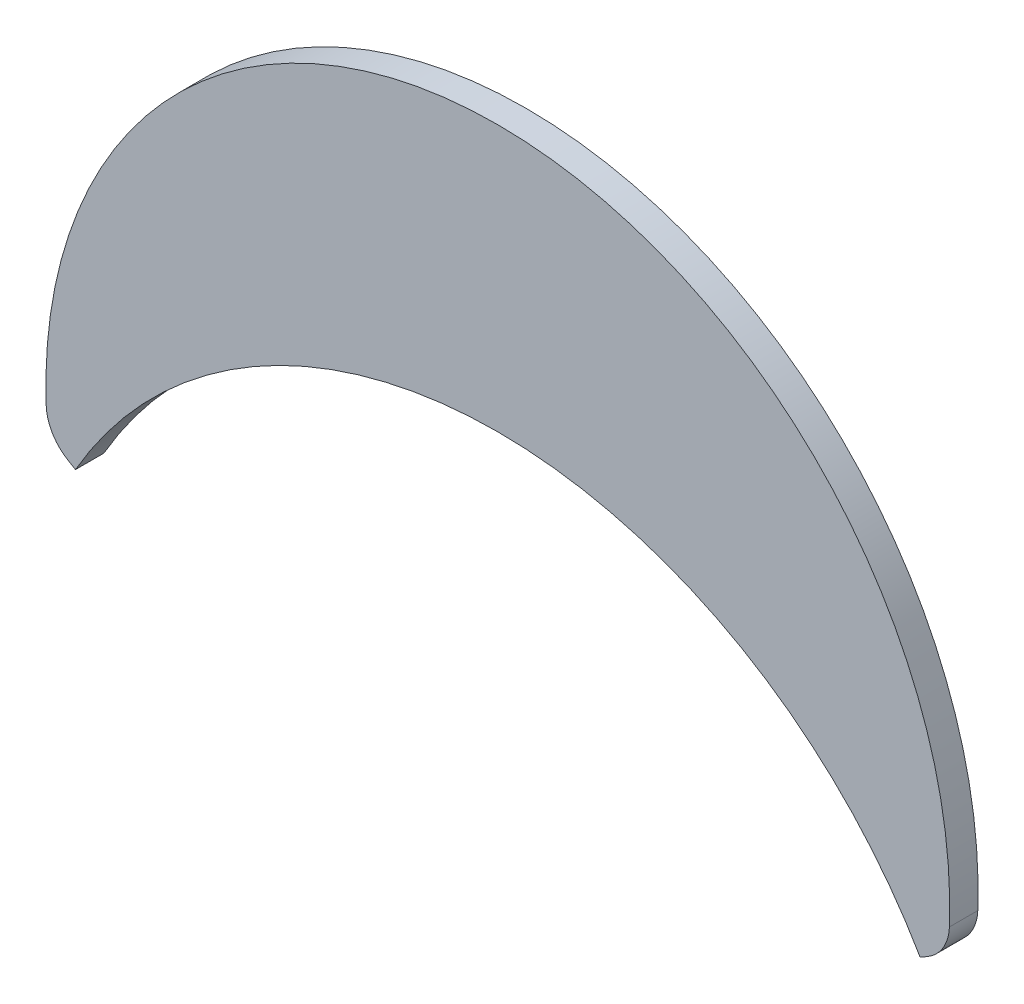
ISO-10303-21;
HEADER;
FILE_DESCRIPTION(('STEP AP214'),'2;1');
FILE_NAME('part.step','',(''),(''),'','','');
FILE_SCHEMA(('AUTOMOTIVE_DESIGN { 1 0 10303 214 1 1 1 1 }'));
ENDSEC;
DATA;
#1=APPLICATION_CONTEXT('core data for automotive mechanical design processes');
#2=APPLICATION_PROTOCOL_DEFINITION('international standard','automotive_design',2000,#1);
#3=PRODUCT_CONTEXT('',#1,'mechanical');
#4=PRODUCT('Part','Part','',(#3));
#5=PRODUCT_RELATED_PRODUCT_CATEGORY('part','',(#4));
#6=PRODUCT_DEFINITION_FORMATION('','',#4);
#7=PRODUCT_DEFINITION_CONTEXT('part definition',#1,'design');
#8=PRODUCT_DEFINITION('design','',#6,#7);
#9=PRODUCT_DEFINITION_SHAPE('','',#8);
#10=(LENGTH_UNIT() NAMED_UNIT(*) SI_UNIT(.MILLI.,.METRE.));
#11=(NAMED_UNIT(*) PLANE_ANGLE_UNIT() SI_UNIT($,.RADIAN.));
#12=(NAMED_UNIT(*) SI_UNIT($,.STERADIAN.) SOLID_ANGLE_UNIT());
#13=UNCERTAINTY_MEASURE_WITH_UNIT(LENGTH_MEASURE(1.E-05),#10,'distance_accuracy_value','');
#14=(GEOMETRIC_REPRESENTATION_CONTEXT(3) GLOBAL_UNCERTAINTY_ASSIGNED_CONTEXT((#13)) GLOBAL_UNIT_ASSIGNED_CONTEXT((#10,
#11,#12)) REPRESENTATION_CONTEXT('',''));
#15=CARTESIAN_POINT('',(0.,0.,0.));
#16=DIRECTION('',(0.,0.,1.));
#17=DIRECTION('',(1.,0.,0.));
#18=AXIS2_PLACEMENT_3D('',#15,#16,#17);
#19=CARTESIAN_POINT('',(15.1229686135858,8.73124999999997,1.016));
#20=DIRECTION('',(-0.499999999999998,0.86602540378444,0.));
#21=DIRECTION('',(-0.86602540378444,-0.499999999999998,0.));
#22=AXIS2_PLACEMENT_3D('',#19,#20,#21);
#23=PLANE('',#22);
#24=DIRECTION('',(0.86602540378444,0.499999999999998,0.));
#25=VECTOR('',#24,1.);
#26=CARTESIAN_POINT('',(15.1229686135858,8.73124999999997,0.));
#27=LINE('',#26,#25);
#28=CARTESIAN_POINT('',(15.1229686135858,8.73124999999997,0.));
#29=VERTEX_POINT('',#28);
#30=CARTESIAN_POINT('',(15.3785341565457,8.87880083502345,0.));
#31=VERTEX_POINT('',#30);
#32=EDGE_CURVE('E139',#29,#31,#27,.T.);
#33=ORIENTED_EDGE('',*,*,#32,.T.);
#34=DIRECTION('',(0.,0.,-1.));
#35=VECTOR('',#34,1.);
#36=CARTESIAN_POINT('',(15.3785341565457,8.87880083502345,1.016));
#37=LINE('',#36,#35);
#38=CARTESIAN_POINT('',(15.3785341565457,8.87880083502345,1.016));
#39=VERTEX_POINT('',#38);
#40=EDGE_CURVE('E103',#31,#39,#37,.F.);
#41=ORIENTED_EDGE('',*,*,#40,.T.);
#42=DIRECTION('',(0.86602540378444,0.499999999999998,0.));
#43=VECTOR('',#42,1.);
#44=CARTESIAN_POINT('',(15.1229686135858,8.73124999999997,1.016));
#45=LINE('',#44,#43);
#46=CARTESIAN_POINT('',(15.1229686135858,8.73124999999997,1.016));
#47=VERTEX_POINT('',#46);
#48=EDGE_CURVE('E96',#47,#39,#45,.T.);
#49=ORIENTED_EDGE('',*,*,#48,.F.);
#50=DIRECTION('',(0.,0.,-1.));
#51=VECTOR('',#50,1.);
#52=CARTESIAN_POINT('',(15.1229686135858,8.73124999999997,1.016));
#53=LINE('',#52,#51);
#54=EDGE_CURVE('E100',#47,#29,#53,.T.);
#55=ORIENTED_EDGE('',*,*,#54,.T.);
#56=EDGE_LOOP('',(#33,#41,#49,#55));
#57=FACE_BOUND('',#56,.T.);
#58=ADVANCED_FACE('F42',(#57),#23,.F.);
#59=CARTESIAN_POINT('',(-23.3718605846326,13.4937499999999,1.016));
#60=DIRECTION('',(0.499999999999998,0.86602540378444,0.));
#61=DIRECTION('',(-0.86602540378444,0.499999999999998,0.));
#62=AXIS2_PLACEMENT_3D('',#59,#60,#61);
#63=PLANE('',#62);
#64=DIRECTION('',(0.86602540378444,-0.499999999999998,0.));
#65=VECTOR('',#64,1.);
#66=CARTESIAN_POINT('',(-23.3718605846326,13.4937499999999,1.016));
#67=LINE('',#66,#65);
#68=CARTESIAN_POINT('',(-15.3785341565457,8.87880083502345,1.016));
#69=VERTEX_POINT('',#68);
#70=CARTESIAN_POINT('',(-15.1229686135858,8.73124999999996,1.016));
#71=VERTEX_POINT('',#70);
#72=EDGE_CURVE('E105',#69,#71,#67,.T.);
#73=ORIENTED_EDGE('',*,*,#72,.F.);
#74=DIRECTION('',(0.,0.,-1.));
#75=VECTOR('',#74,1.);
#76=CARTESIAN_POINT('',(-15.3785341565457,8.87880083502345,0.));
#77=LINE('',#76,#75);
#78=CARTESIAN_POINT('',(-15.3785341565457,8.87880083502345,0.));
#79=VERTEX_POINT('',#78);
#80=EDGE_CURVE('E12',#69,#79,#77,.T.);
#81=ORIENTED_EDGE('',*,*,#80,.T.);
#82=DIRECTION('',(0.86602540378444,-0.499999999999998,0.));
#83=VECTOR('',#82,1.);
#84=CARTESIAN_POINT('',(-23.3718605846326,13.4937499999999,0.));
#85=LINE('',#84,#83);
#86=CARTESIAN_POINT('',(-15.1229686135858,8.73124999999996,0.));
#87=VERTEX_POINT('',#86);
#88=EDGE_CURVE('E114',#79,#87,#85,.T.);
#89=ORIENTED_EDGE('',*,*,#88,.T.);
#90=DIRECTION('',(0.,0.,-1.));
#91=VECTOR('',#90,1.);
#92=CARTESIAN_POINT('',(-15.1229686135858,8.73124999999996,1.016));
#93=LINE('',#92,#91);
#94=EDGE_CURVE('E120',#71,#87,#93,.T.);
#95=ORIENTED_EDGE('',*,*,#94,.F.);
#96=EDGE_LOOP('',(#73,#81,#89,#95));
#97=FACE_BOUND('',#96,.T.);
#98=ADVANCED_FACE('F154',(#97),#63,.F.);
#99=CARTESIAN_POINT('',(0.,0.,1.016));
#100=DIRECTION('',(0.,0.,1.));
#101=DIRECTION('',(1.,0.,0.));
#102=AXIS2_PLACEMENT_3D('',#99,#100,#101);
#103=PLANE('',#102);
#104=ORIENTED_EDGE('',*,*,#48,.T.);
#105=CARTESIAN_POINT('',(14.5847841565457,10.2536161635313,1.016));
#106=DIRECTION('',(0.,0.,1.));
#107=DIRECTION('',(1.,0.,0.));
#108=AXIS2_PLACEMENT_3D('',#105,#106,#107);
#109=CIRCLE('',#108,1.5875);
#110=CARTESIAN_POINT('',(16.1711517077853,10.1936641629468,1.016));
#111=VERTEX_POINT('',#110);
#112=EDGE_CURVE('E130',#39,#111,#109,.T.);
#113=ORIENTED_EDGE('',*,*,#112,.T.);
#114=CARTESIAN_POINT('',(0.,10.8048043087971,1.016));
#115=DIRECTION('',(0.,0.,1.));
#116=DIRECTION('',(-1.,0.,0.));
#117=AXIS2_PLACEMENT_3D('',#114,#115,#116);
#118=CIRCLE('',#117,16.1826956912029);
#119=CARTESIAN_POINT('',(-16.1711517077853,10.1936641629468,1.016));
#120=VERTEX_POINT('',#119);
#121=EDGE_CURVE('E146',#111,#120,#118,.T.);
#122=ORIENTED_EDGE('',*,*,#121,.T.);
#123=CARTESIAN_POINT('',(-14.5847841565457,10.2536161635313,1.016));
#124=DIRECTION('',(0.,0.,1.));
#125=DIRECTION('',(1.,0.,0.));
#126=AXIS2_PLACEMENT_3D('',#123,#124,#125);
#127=CIRCLE('',#126,1.5875);
#128=EDGE_CURVE('E128',#120,#69,#127,.T.);
#129=ORIENTED_EDGE('',*,*,#128,.T.);
#130=ORIENTED_EDGE('',*,*,#72,.T.);
#131=CARTESIAN_POINT('',(0.,0.,1.016));
#132=DIRECTION('',(0.,0.,-1.));
#133=DIRECTION('',(1.,0.,0.));
#134=AXIS2_PLACEMENT_3D('',#131,#132,#133);
#135=CIRCLE('',#134,17.4625);
#136=EDGE_CURVE('E106',#71,#47,#135,.T.);
#137=ORIENTED_EDGE('',*,*,#136,.T.);
#138=EDGE_LOOP('',(#104,#113,#122,#129,#130,#137));
#139=FACE_BOUND('',#138,.T.);
#140=ADVANCED_FACE('F109',(#139),#103,.T.);
#141=CARTESIAN_POINT('',(0.,0.,0.));
#142=DIRECTION('',(0.,0.,1.));
#143=DIRECTION('',(1.,0.,0.));
#144=AXIS2_PLACEMENT_3D('',#141,#142,#143);
#145=PLANE('',#144);
#146=CARTESIAN_POINT('',(0.,10.8048043087971,0.));
#147=DIRECTION('',(0.,0.,1.));
#148=DIRECTION('',(1.,0.,0.));
#149=AXIS2_PLACEMENT_3D('',#146,#147,#148);
#150=CIRCLE('',#149,16.1826956912029);
#151=CARTESIAN_POINT('',(16.1711517077853,10.1936641629468,0.));
#152=VERTEX_POINT('',#151);
#153=CARTESIAN_POINT('',(-16.1711517077853,10.1936641629468,0.));
#154=VERTEX_POINT('',#153);
#155=EDGE_CURVE('E119',#152,#154,#150,.T.);
#156=ORIENTED_EDGE('',*,*,#155,.F.);
#157=CARTESIAN_POINT('',(14.5847841565457,10.2536161635313,0.));
#158=DIRECTION('',(0.,0.,1.));
#159=DIRECTION('',(1.,0.,0.));
#160=AXIS2_PLACEMENT_3D('',#157,#158,#159);
#161=CIRCLE('',#160,1.5875);
#162=EDGE_CURVE('E50',#152,#31,#161,.F.);
#163=ORIENTED_EDGE('',*,*,#162,.T.);
#164=ORIENTED_EDGE('',*,*,#32,.F.);
#165=CARTESIAN_POINT('',(0.,0.,0.));
#166=DIRECTION('',(0.,0.,-1.));
#167=DIRECTION('',(1.,0.,0.));
#168=AXIS2_PLACEMENT_3D('',#165,#166,#167);
#169=CIRCLE('',#168,17.4625);
#170=EDGE_CURVE('E118',#87,#29,#169,.T.);
#171=ORIENTED_EDGE('',*,*,#170,.F.);
#172=ORIENTED_EDGE('',*,*,#88,.F.);
#173=CARTESIAN_POINT('',(-14.5847841565457,10.2536161635313,0.));
#174=DIRECTION('',(0.,0.,1.));
#175=DIRECTION('',(1.,0.,0.));
#176=AXIS2_PLACEMENT_3D('',#173,#174,#175);
#177=CIRCLE('',#176,1.5875);
#178=EDGE_CURVE('E62',#79,#154,#177,.F.);
#179=ORIENTED_EDGE('',*,*,#178,.T.);
#180=EDGE_LOOP('',(#156,#163,#164,#171,#172,#179));
#181=FACE_BOUND('',#180,.T.);
#182=ADVANCED_FACE('F138',(#181),#145,.F.);
#183=CARTESIAN_POINT('',(0.,0.,1.016));
#184=DIRECTION('',(0.,0.,-1.));
#185=DIRECTION('',(-1.,0.,0.));
#186=AXIS2_PLACEMENT_3D('',#183,#184,#185);
#187=CYLINDRICAL_SURFACE('',#186,17.4625);
#188=ORIENTED_EDGE('',*,*,#170,.T.);
#189=ORIENTED_EDGE('',*,*,#54,.F.);
#190=ORIENTED_EDGE('',*,*,#136,.F.);
#191=ORIENTED_EDGE('',*,*,#94,.T.);
#192=EDGE_LOOP('',(#188,#189,#190,#191));
#193=FACE_BOUND('',#192,.T.);
#194=ADVANCED_FACE('F116',(#193),#187,.F.);
#195=CARTESIAN_POINT('',(0.,10.8048043087971,0.));
#196=DIRECTION('',(0.,0.,1.));
#197=DIRECTION('',(1.,0.,0.));
#198=AXIS2_PLACEMENT_3D('',#195,#196,#197);
#199=CYLINDRICAL_SURFACE('',#198,16.1826956912029);
#200=ORIENTED_EDGE('',*,*,#121,.F.);
#201=DIRECTION('',(0.,0.,1.));
#202=VECTOR('',#201,1.);
#203=CARTESIAN_POINT('',(16.1711517077853,10.1936641629468,0.));
#204=LINE('',#203,#202);
#205=EDGE_CURVE('E135',#111,#152,#204,.F.);
#206=ORIENTED_EDGE('',*,*,#205,.T.);
#207=ORIENTED_EDGE('',*,*,#155,.T.);
#208=DIRECTION('',(0.,0.,1.));
#209=VECTOR('',#208,1.);
#210=CARTESIAN_POINT('',(-16.1711517077853,10.1936641629468,0.));
#211=LINE('',#210,#209);
#212=EDGE_CURVE('E132',#154,#120,#211,.T.);
#213=ORIENTED_EDGE('',*,*,#212,.T.);
#214=EDGE_LOOP('',(#200,#206,#207,#213));
#215=FACE_BOUND('',#214,.T.);
#216=ADVANCED_FACE('F148',(#215),#199,.T.);
#217=CARTESIAN_POINT('',(14.5847841565457,10.2536161635313,0.));
#218=DIRECTION('',(0.,0.,1.));
#219=DIRECTION('',(1.,0.,0.));
#220=AXIS2_PLACEMENT_3D('',#217,#218,#219);
#221=CYLINDRICAL_SURFACE('',#220,1.5875);
#222=ORIENTED_EDGE('',*,*,#162,.F.);
#223=ORIENTED_EDGE('',*,*,#205,.F.);
#224=ORIENTED_EDGE('',*,*,#112,.F.);
#225=ORIENTED_EDGE('',*,*,#40,.F.);
#226=EDGE_LOOP('',(#222,#223,#224,#225));
#227=FACE_BOUND('',#226,.T.);
#228=ADVANCED_FACE('F143',(#227),#221,.T.);
#229=CARTESIAN_POINT('',(-14.5847841565457,10.2536161635313,0.));
#230=DIRECTION('',(0.,0.,1.));
#231=DIRECTION('',(1.,0.,0.));
#232=AXIS2_PLACEMENT_3D('',#229,#230,#231);
#233=CYLINDRICAL_SURFACE('',#232,1.5875);
#234=ORIENTED_EDGE('',*,*,#178,.F.);
#235=ORIENTED_EDGE('',*,*,#80,.F.);
#236=ORIENTED_EDGE('',*,*,#128,.F.);
#237=ORIENTED_EDGE('',*,*,#212,.F.);
#238=EDGE_LOOP('',(#234,#235,#236,#237));
#239=FACE_BOUND('',#238,.T.);
#240=ADVANCED_FACE('F44',(#239),#233,.T.);
#241=CLOSED_SHELL('',(#58,#98,#140,#182,#194,#216,#228,#240));
#242=MANIFOLD_SOLID_BREP('B2',#241);
#243=ADVANCED_BREP_SHAPE_REPRESENTATION('',(#18,#242),#14);
#244=SHAPE_DEFINITION_REPRESENTATION(#9,#243);
ENDSEC;
END-ISO-10303-21;
